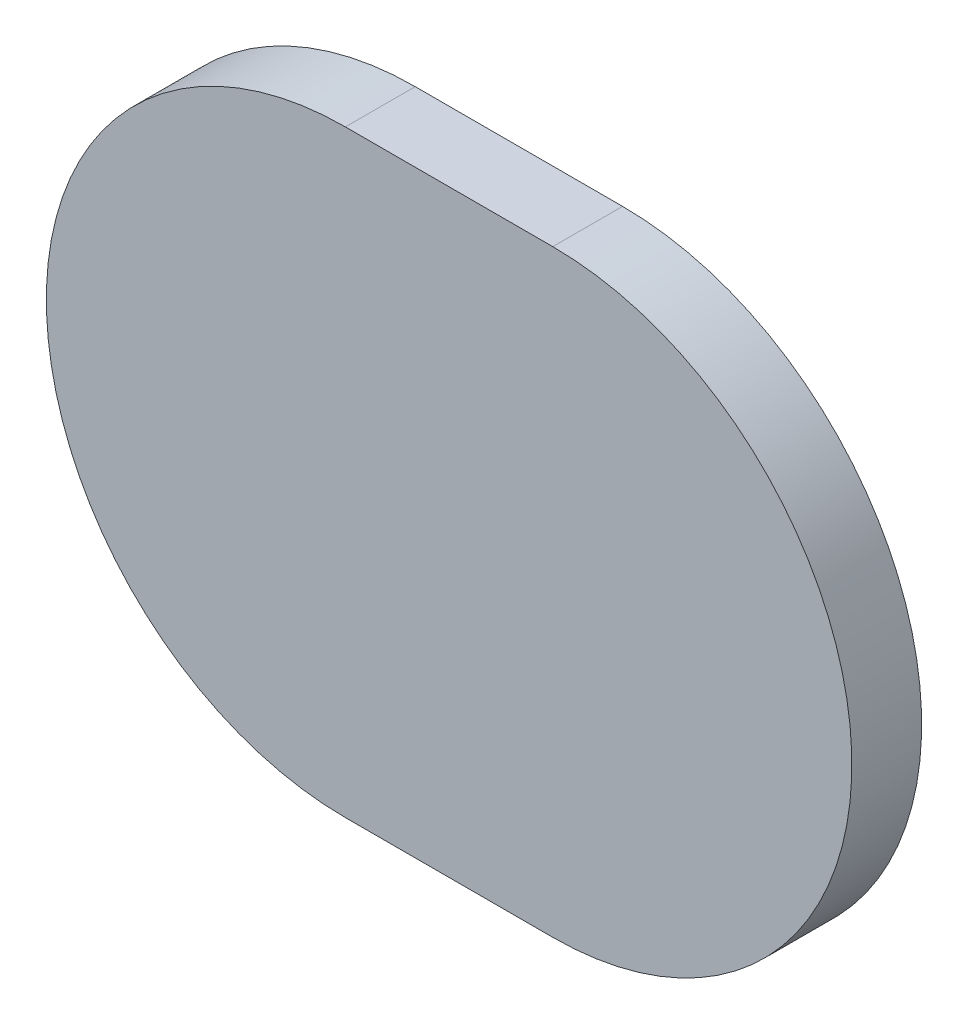
ISO-10303-21;
HEADER;
FILE_DESCRIPTION(('STEP AP214'),'2;1');
FILE_NAME('part.step','',(''),(''),'','','');
FILE_SCHEMA(('AUTOMOTIVE_DESIGN { 1 0 10303 214 1 1 1 1 }'));
ENDSEC;
DATA;
#1=APPLICATION_CONTEXT('core data for automotive mechanical design processes');
#2=APPLICATION_PROTOCOL_DEFINITION('international standard','automotive_design',2000,#1);
#3=PRODUCT_CONTEXT('',#1,'mechanical');
#4=PRODUCT('Part','Part','',(#3));
#5=PRODUCT_RELATED_PRODUCT_CATEGORY('part','',(#4));
#6=PRODUCT_DEFINITION_FORMATION('','',#4);
#7=PRODUCT_DEFINITION_CONTEXT('part definition',#1,'design');
#8=PRODUCT_DEFINITION('design','',#6,#7);
#9=PRODUCT_DEFINITION_SHAPE('','',#8);
#10=(LENGTH_UNIT() NAMED_UNIT(*) SI_UNIT(.MILLI.,.METRE.));
#11=(NAMED_UNIT(*) PLANE_ANGLE_UNIT() SI_UNIT($,.RADIAN.));
#12=(NAMED_UNIT(*) SI_UNIT($,.STERADIAN.) SOLID_ANGLE_UNIT());
#13=UNCERTAINTY_MEASURE_WITH_UNIT(LENGTH_MEASURE(1.E-05),#10,'distance_accuracy_value','');
#14=(GEOMETRIC_REPRESENTATION_CONTEXT(3) GLOBAL_UNCERTAINTY_ASSIGNED_CONTEXT((#13)) GLOBAL_UNIT_ASSIGNED_CONTEXT((#10,
#11,#12)) REPRESENTATION_CONTEXT('',''));
#15=CARTESIAN_POINT('',(0.,0.,0.));
#16=DIRECTION('',(0.,0.,1.));
#17=DIRECTION('',(1.,0.,0.));
#18=AXIS2_PLACEMENT_3D('',#15,#16,#17);
#19=CARTESIAN_POINT('',(130.564,-115.704,1.635));
#20=DIRECTION('',(0.,0.,1.));
#21=DIRECTION('',(1.,0.,0.));
#22=AXIS2_PLACEMENT_3D('',#19,#20,#21);
#23=PLANE('',#22);
#24=DIRECTION('',(1.,0.,0.));
#25=VECTOR('',#24,1.);
#26=CARTESIAN_POINT('',(130.564,-115.704,1.635));
#27=LINE('',#26,#25);
#28=CARTESIAN_POINT('',(130.564,-115.704,1.635));
#29=VERTEX_POINT('',#28);
#30=CARTESIAN_POINT('',(130.668,-115.704,1.635));
#31=VERTEX_POINT('',#30);
#32=EDGE_CURVE('E82',#29,#31,#27,.T.);
#33=ORIENTED_EDGE('',*,*,#32,.T.);
#34=CARTESIAN_POINT('',(130.668,-115.554,1.635));
#35=DIRECTION('',(0.,0.,1.));
#36=DIRECTION('',(0.,-1.,0.));
#37=AXIS2_PLACEMENT_3D('',#34,#35,#36);
#38=CIRCLE('',#37,0.15);
#39=CARTESIAN_POINT('',(130.668,-115.404,1.635));
#40=VERTEX_POINT('',#39);
#41=EDGE_CURVE('E101',#31,#40,#38,.T.);
#42=ORIENTED_EDGE('',*,*,#41,.T.);
#43=DIRECTION('',(-1.,0.,0.));
#44=VECTOR('',#43,1.);
#45=CARTESIAN_POINT('',(130.668,-115.404,1.635));
#46=LINE('',#45,#44);
#47=CARTESIAN_POINT('',(130.564,-115.404,1.635));
#48=VERTEX_POINT('',#47);
#49=EDGE_CURVE('E74',#40,#48,#46,.T.);
#50=ORIENTED_EDGE('',*,*,#49,.T.);
#51=CARTESIAN_POINT('',(130.564,-115.554,1.635));
#52=DIRECTION('',(0.,0.,1.));
#53=DIRECTION('',(1.894780628694E-13,1.,0.));
#54=AXIS2_PLACEMENT_3D('',#51,#52,#53);
#55=CIRCLE('',#54,0.15);
#56=EDGE_CURVE('E11',#48,#29,#55,.T.);
#57=ORIENTED_EDGE('',*,*,#56,.T.);
#58=EDGE_LOOP('',(#33,#42,#50,#57));
#59=FACE_BOUND('',#58,.T.);
#60=ADVANCED_FACE('F17',(#59),#23,.T.);
#61=CARTESIAN_POINT('',(130.564,-115.704,1.6));
#62=DIRECTION('',(0.,0.,1.));
#63=DIRECTION('',(1.,0.,0.));
#64=AXIS2_PLACEMENT_3D('',#61,#62,#63);
#65=PLANE('',#64);
#66=CARTESIAN_POINT('',(130.564,-115.554,1.6));
#67=DIRECTION('',(0.,0.,1.));
#68=DIRECTION('',(1.894780628694E-13,1.,0.));
#69=AXIS2_PLACEMENT_3D('',#66,#67,#68);
#70=CIRCLE('',#69,0.15);
#71=CARTESIAN_POINT('',(130.564,-115.404,1.6));
#72=VERTEX_POINT('',#71);
#73=CARTESIAN_POINT('',(130.564,-115.704,1.6));
#74=VERTEX_POINT('',#73);
#75=EDGE_CURVE('E25',#72,#74,#70,.T.);
#76=ORIENTED_EDGE('',*,*,#75,.F.);
#77=DIRECTION('',(-1.,0.,0.));
#78=VECTOR('',#77,1.);
#79=CARTESIAN_POINT('',(130.668,-115.404,1.6));
#80=LINE('',#79,#78);
#81=CARTESIAN_POINT('',(130.668,-115.404,1.6));
#82=VERTEX_POINT('',#81);
#83=EDGE_CURVE('E99',#82,#72,#80,.T.);
#84=ORIENTED_EDGE('',*,*,#83,.F.);
#85=CARTESIAN_POINT('',(130.668,-115.554,1.6));
#86=DIRECTION('',(0.,0.,1.));
#87=DIRECTION('',(0.,-1.,0.));
#88=AXIS2_PLACEMENT_3D('',#85,#86,#87);
#89=CIRCLE('',#88,0.15);
#90=CARTESIAN_POINT('',(130.668,-115.704,1.6));
#91=VERTEX_POINT('',#90);
#92=EDGE_CURVE('E84',#91,#82,#89,.T.);
#93=ORIENTED_EDGE('',*,*,#92,.F.);
#94=DIRECTION('',(1.,0.,0.));
#95=VECTOR('',#94,1.);
#96=CARTESIAN_POINT('',(130.564,-115.704,1.6));
#97=LINE('',#96,#95);
#98=EDGE_CURVE('E80',#74,#91,#97,.T.);
#99=ORIENTED_EDGE('',*,*,#98,.F.);
#100=EDGE_LOOP('',(#76,#84,#93,#99));
#101=FACE_BOUND('',#100,.T.);
#102=ADVANCED_FACE('F86',(#101),#65,.F.);
#103=CARTESIAN_POINT('',(130.564,-115.554,1.6));
#104=DIRECTION('',(0.,0.,-1.));
#105=DIRECTION('',(1.894780628694E-13,1.,0.));
#106=AXIS2_PLACEMENT_3D('',#103,#104,#105);
#107=CYLINDRICAL_SURFACE('',#106,0.15);
#108=ORIENTED_EDGE('',*,*,#75,.T.);
#109=DIRECTION('',(0.,0.,1.));
#110=VECTOR('',#109,1.);
#111=CARTESIAN_POINT('',(130.564,-115.704,1.6));
#112=LINE('',#111,#110);
#113=EDGE_CURVE('E68',#74,#29,#112,.T.);
#114=ORIENTED_EDGE('',*,*,#113,.T.);
#115=ORIENTED_EDGE('',*,*,#56,.F.);
#116=DIRECTION('',(0.,0.,1.));
#117=VECTOR('',#116,1.);
#118=CARTESIAN_POINT('',(130.564,-115.404,1.6));
#119=LINE('',#118,#117);
#120=EDGE_CURVE('E71',#72,#48,#119,.T.);
#121=ORIENTED_EDGE('',*,*,#120,.F.);
#122=EDGE_LOOP('',(#108,#114,#115,#121));
#123=FACE_BOUND('',#122,.T.);
#124=ADVANCED_FACE('F67',(#123),#107,.T.);
#125=CARTESIAN_POINT('',(130.668,-115.404,1.6));
#126=DIRECTION('',(0.,-1.,0.));
#127=DIRECTION('',(0.,0.,-1.));
#128=AXIS2_PLACEMENT_3D('',#125,#126,#127);
#129=PLANE('',#128);
#130=ORIENTED_EDGE('',*,*,#83,.T.);
#131=ORIENTED_EDGE('',*,*,#120,.T.);
#132=ORIENTED_EDGE('',*,*,#49,.F.);
#133=DIRECTION('',(0.,0.,1.));
#134=VECTOR('',#133,1.);
#135=CARTESIAN_POINT('',(130.668,-115.404,1.6));
#136=LINE('',#135,#134);
#137=EDGE_CURVE('E105',#82,#40,#136,.T.);
#138=ORIENTED_EDGE('',*,*,#137,.F.);
#139=EDGE_LOOP('',(#130,#131,#132,#138));
#140=FACE_BOUND('',#139,.T.);
#141=ADVANCED_FACE('F120',(#140),#129,.F.);
#142=CARTESIAN_POINT('',(130.668,-115.554,1.6));
#143=DIRECTION('',(0.,0.,-1.));
#144=DIRECTION('',(0.,-1.,0.));
#145=AXIS2_PLACEMENT_3D('',#142,#143,#144);
#146=CYLINDRICAL_SURFACE('',#145,0.15);
#147=ORIENTED_EDGE('',*,*,#92,.T.);
#148=ORIENTED_EDGE('',*,*,#137,.T.);
#149=ORIENTED_EDGE('',*,*,#41,.F.);
#150=DIRECTION('',(0.,0.,1.));
#151=VECTOR('',#150,1.);
#152=CARTESIAN_POINT('',(130.668,-115.704,1.6));
#153=LINE('',#152,#151);
#154=EDGE_CURVE('E90',#91,#31,#153,.T.);
#155=ORIENTED_EDGE('',*,*,#154,.F.);
#156=EDGE_LOOP('',(#147,#148,#149,#155));
#157=FACE_BOUND('',#156,.T.);
#158=ADVANCED_FACE('F122',(#157),#146,.T.);
#159=CARTESIAN_POINT('',(130.564,-115.704,1.6));
#160=DIRECTION('',(0.,1.,0.));
#161=DIRECTION('',(1.,0.,0.));
#162=AXIS2_PLACEMENT_3D('',#159,#160,#161);
#163=PLANE('',#162);
#164=ORIENTED_EDGE('',*,*,#98,.T.);
#165=ORIENTED_EDGE('',*,*,#154,.T.);
#166=ORIENTED_EDGE('',*,*,#32,.F.);
#167=ORIENTED_EDGE('',*,*,#113,.F.);
#168=EDGE_LOOP('',(#164,#165,#166,#167));
#169=FACE_BOUND('',#168,.T.);
#170=ADVANCED_FACE('F78',(#169),#163,.F.);
#171=CLOSED_SHELL('',(#60,#102,#124,#141,#158,#170));
#172=MANIFOLD_SOLID_BREP('B1',#171);
#173=ADVANCED_BREP_SHAPE_REPRESENTATION('',(#18,#172),#14);
#174=SHAPE_DEFINITION_REPRESENTATION(#9,#173);
ENDSEC;
END-ISO-10303-21;
